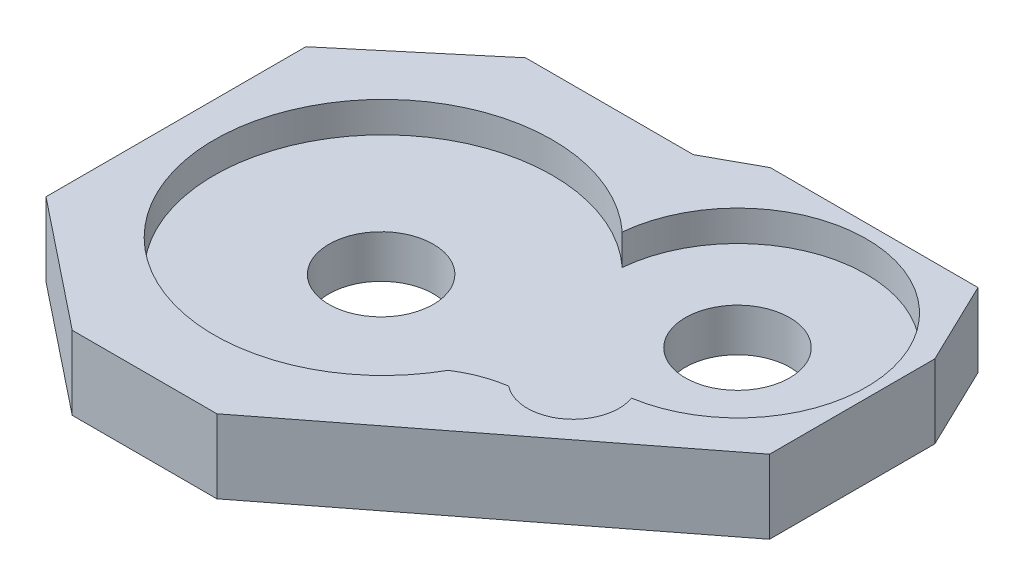
ISO-10303-21;
HEADER;
FILE_DESCRIPTION(('STEP AP214'),'2;1');
FILE_NAME('part.step','',(''),(''),'','','');
FILE_SCHEMA(('AUTOMOTIVE_DESIGN { 1 0 10303 214 1 1 1 1 }'));
ENDSEC;
DATA;
#1=APPLICATION_CONTEXT('core data for automotive mechanical design processes');
#2=APPLICATION_PROTOCOL_DEFINITION('international standard','automotive_design',2000,#1);
#3=PRODUCT_CONTEXT('',#1,'mechanical');
#4=PRODUCT('Part','Part','',(#3));
#5=PRODUCT_RELATED_PRODUCT_CATEGORY('part','',(#4));
#6=PRODUCT_DEFINITION_FORMATION('','',#4);
#7=PRODUCT_DEFINITION_CONTEXT('part definition',#1,'design');
#8=PRODUCT_DEFINITION('design','',#6,#7);
#9=PRODUCT_DEFINITION_SHAPE('','',#8);
#10=(LENGTH_UNIT() NAMED_UNIT(*) SI_UNIT(.MILLI.,.METRE.));
#11=(NAMED_UNIT(*) PLANE_ANGLE_UNIT() SI_UNIT($,.RADIAN.));
#12=(NAMED_UNIT(*) SI_UNIT($,.STERADIAN.) SOLID_ANGLE_UNIT());
#13=UNCERTAINTY_MEASURE_WITH_UNIT(LENGTH_MEASURE(1.E-05),#10,'distance_accuracy_value','');
#14=(GEOMETRIC_REPRESENTATION_CONTEXT(3) GLOBAL_UNCERTAINTY_ASSIGNED_CONTEXT((#13)) GLOBAL_UNIT_ASSIGNED_CONTEXT((#10,
#11,#12)) REPRESENTATION_CONTEXT('',''));
#15=CARTESIAN_POINT('',(0.,0.,0.));
#16=DIRECTION('',(0.,0.,1.));
#17=DIRECTION('',(1.,0.,0.));
#18=AXIS2_PLACEMENT_3D('',#15,#16,#17);
#19=CARTESIAN_POINT('',(13.9143508609378,10.,-16.1393030331925));
#20=DIRECTION('',(0.642916671040221,0.,0.765936129255279));
#21=DIRECTION('',(0.765936129255279,0.,-0.642916671040221));
#22=AXIS2_PLACEMENT_3D('',#19,#20,#21);
#23=PLANE('',#22);
#24=DIRECTION('',(-0.765936129255279,0.,0.642916671040221));
#25=VECTOR('',#24,1.);
#26=CARTESIAN_POINT('',(13.9143508609378,-2.,-16.1393030331925));
#27=LINE('',#26,#25);
#28=CARTESIAN_POINT('',(13.9143508609378,-2.,-16.1393030331925));
#29=VERTEX_POINT('',#28);
#30=CARTESIAN_POINT('',(-5.5384916629242,-2.,0.189156064136099));
#31=VERTEX_POINT('',#30);
#32=EDGE_CURVE('E153',#29,#31,#27,.T.);
#33=ORIENTED_EDGE('',*,*,#32,.T.);
#34=DIRECTION('',(0.,-1.,0.));
#35=VECTOR('',#34,1.);
#36=CARTESIAN_POINT('',(-5.5384916629242,10.,0.189156064136099));
#37=LINE('',#36,#35);
#38=CARTESIAN_POINT('',(-5.5384916629242,10.,0.189156064136099));
#39=VERTEX_POINT('',#38);
#40=EDGE_CURVE('E11',#39,#31,#37,.T.);
#41=ORIENTED_EDGE('',*,*,#40,.F.);
#42=DIRECTION('',(-0.765936129255279,0.,0.642916671040221));
#43=VECTOR('',#42,1.);
#44=CARTESIAN_POINT('',(13.9143508609378,10.,-16.1393030331925));
#45=LINE('',#44,#43);
#46=CARTESIAN_POINT('',(13.9143508609378,10.,-16.1393030331925));
#47=VERTEX_POINT('',#46);
#48=EDGE_CURVE('E173',#47,#39,#45,.T.);
#49=ORIENTED_EDGE('',*,*,#48,.F.);
#50=DIRECTION('',(0.,-1.,0.));
#51=VECTOR('',#50,1.);
#52=CARTESIAN_POINT('',(13.9143508609378,10.,-16.1393030331925));
#53=LINE('',#52,#51);
#54=EDGE_CURVE('E149',#47,#29,#53,.T.);
#55=ORIENTED_EDGE('',*,*,#54,.T.);
#56=EDGE_LOOP('',(#33,#41,#49,#55));
#57=FACE_BOUND('',#56,.T.);
#58=ADVANCED_FACE('F31',(#57),#23,.F.);
#59=CARTESIAN_POINT('',(-5.5384916629242,10.,0.189156064136099));
#60=DIRECTION('',(1.,0.,0.));
#61=DIRECTION('',(0.,0.,-1.));
#62=AXIS2_PLACEMENT_3D('',#59,#60,#61);
#63=PLANE('',#62);
#64=DIRECTION('',(0.,0.,1.));
#65=VECTOR('',#64,1.);
#66=CARTESIAN_POINT('',(-5.5384916629242,-2.,0.189156064136099));
#67=LINE('',#66,#65);
#68=CARTESIAN_POINT('',(-5.53849166292486,-2.,42.5147251773403));
#69=VERTEX_POINT('',#68);
#70=EDGE_CURVE('E156',#31,#69,#67,.T.);
#71=ORIENTED_EDGE('',*,*,#70,.T.);
#72=DIRECTION('',(0.,-1.,0.));
#73=VECTOR('',#72,1.);
#74=CARTESIAN_POINT('',(-5.53849166292486,10.,42.5147251773403));
#75=LINE('',#74,#73);
#76=CARTESIAN_POINT('',(-5.53849166292486,10.,42.5147251773403));
#77=VERTEX_POINT('',#76);
#78=EDGE_CURVE('E39',#77,#69,#75,.T.);
#79=ORIENTED_EDGE('',*,*,#78,.F.);
#80=DIRECTION('',(0.,0.,1.));
#81=VECTOR('',#80,1.);
#82=CARTESIAN_POINT('',(-5.5384916629242,10.,0.189156064136099));
#83=LINE('',#82,#81);
#84=EDGE_CURVE('E103',#39,#77,#83,.T.);
#85=ORIENTED_EDGE('',*,*,#84,.F.);
#86=ORIENTED_EDGE('',*,*,#40,.T.);
#87=EDGE_LOOP('',(#71,#79,#85,#86));
#88=FACE_BOUND('',#87,.T.);
#89=ADVANCED_FACE('F262',(#88),#63,.F.);
#90=CARTESIAN_POINT('',(15.4262000704736,10.,59.2085639757232));
#91=DIRECTION('',(0.622920671515874,0.,-0.7822850100815));
#92=DIRECTION('',(-0.7822850100815,0.,-0.622920671515874));
#93=AXIS2_PLACEMENT_3D('',#90,#91,#92);
#94=PLANE('',#93);
#95=DIRECTION('',(0.7822850100815,0.,0.622920671515874));
#96=VECTOR('',#95,1.);
#97=CARTESIAN_POINT('',(15.4262000704736,-2.,59.2085639757232));
#98=LINE('',#97,#96);
#99=CARTESIAN_POINT('',(15.4262000704736,-2.,59.2085639757232));
#100=VERTEX_POINT('',#99);
#101=EDGE_CURVE('E159',#69,#100,#98,.T.);
#102=ORIENTED_EDGE('',*,*,#101,.T.);
#103=DIRECTION('',(0.,-1.,0.));
#104=VECTOR('',#103,1.);
#105=CARTESIAN_POINT('',(15.4262000704736,10.,59.2085639757232));
#106=LINE('',#105,#104);
#107=CARTESIAN_POINT('',(15.4262000704736,10.,59.2085639757232));
#108=VERTEX_POINT('',#107);
#109=EDGE_CURVE('E186',#108,#100,#106,.T.);
#110=ORIENTED_EDGE('',*,*,#109,.F.);
#111=DIRECTION('',(0.7822850100815,0.,0.622920671515874));
#112=VECTOR('',#111,1.);
#113=CARTESIAN_POINT('',(15.4262000704736,10.,59.2085639757232));
#114=LINE('',#113,#112);
#115=EDGE_CURVE('E236',#77,#108,#114,.T.);
#116=ORIENTED_EDGE('',*,*,#115,.F.);
#117=ORIENTED_EDGE('',*,*,#78,.T.);
#118=EDGE_LOOP('',(#102,#110,#116,#117));
#119=FACE_BOUND('',#118,.T.);
#120=ADVANCED_FACE('F265',(#119),#94,.F.);
#121=CARTESIAN_POINT('',(38.9784117994287,10.,59.2085639757232));
#122=DIRECTION('',(0.,0.,-1.));
#123=DIRECTION('',(-1.,0.,0.));
#124=AXIS2_PLACEMENT_3D('',#121,#122,#123);
#125=PLANE('',#124);
#126=DIRECTION('',(1.,0.,0.));
#127=VECTOR('',#126,1.);
#128=CARTESIAN_POINT('',(38.9784117994287,-2.,59.2085639757232));
#129=LINE('',#128,#127);
#130=CARTESIAN_POINT('',(38.9784117994287,-2.,59.2085639757232));
#131=VERTEX_POINT('',#130);
#132=EDGE_CURVE('E161',#100,#131,#129,.T.);
#133=ORIENTED_EDGE('',*,*,#132,.T.);
#134=DIRECTION('',(0.,-1.,0.));
#135=VECTOR('',#134,1.);
#136=CARTESIAN_POINT('',(38.9784117994287,10.,59.2085639757232));
#137=LINE('',#136,#135);
#138=CARTESIAN_POINT('',(38.9784117994287,10.,59.2085639757232));
#139=VERTEX_POINT('',#138);
#140=EDGE_CURVE('E183',#139,#131,#137,.T.);
#141=ORIENTED_EDGE('',*,*,#140,.F.);
#142=DIRECTION('',(1.,0.,0.));
#143=VECTOR('',#142,1.);
#144=CARTESIAN_POINT('',(38.9784117994287,10.,59.2085639757232));
#145=LINE('',#144,#143);
#146=EDGE_CURVE('E238',#108,#139,#145,.T.);
#147=ORIENTED_EDGE('',*,*,#146,.F.);
#148=ORIENTED_EDGE('',*,*,#109,.T.);
#149=EDGE_LOOP('',(#133,#141,#147,#148));
#150=FACE_BOUND('',#149,.T.);
#151=ADVANCED_FACE('F270',(#150),#125,.F.);
#152=CARTESIAN_POINT('',(38.9784117994287,10.,59.2085639757232));
#153=DIRECTION('',(-0.612548801535923,0.,-0.790432771168368));
#154=DIRECTION('',(-0.790432771168368,0.,0.612548801535923));
#155=AXIS2_PLACEMENT_3D('',#152,#153,#154);
#156=PLANE('',#155);
#157=DIRECTION('',(0.790432771168368,0.,-0.612548801535923));
#158=VECTOR('',#157,1.);
#159=CARTESIAN_POINT('',(38.9784117994287,-2.,59.2085639757232));
#160=LINE('',#159,#158);
#161=CARTESIAN_POINT('',(89.6958984765078,-2.,19.9048599617339));
#162=VERTEX_POINT('',#161);
#163=EDGE_CURVE('E163',#131,#162,#160,.T.);
#164=ORIENTED_EDGE('',*,*,#163,.T.);
#165=DIRECTION('',(0.,-1.,0.));
#166=VECTOR('',#165,1.);
#167=CARTESIAN_POINT('',(89.6958984765078,10.,19.9048599617339));
#168=LINE('',#167,#166);
#169=CARTESIAN_POINT('',(89.6958984765078,10.,19.9048599617339));
#170=VERTEX_POINT('',#169);
#171=EDGE_CURVE('E180',#170,#162,#168,.T.);
#172=ORIENTED_EDGE('',*,*,#171,.F.);
#173=DIRECTION('',(0.790432771168368,0.,-0.612548801535923));
#174=VECTOR('',#173,1.);
#175=CARTESIAN_POINT('',(38.9784117994287,10.,59.2085639757232));
#176=LINE('',#175,#174);
#177=EDGE_CURVE('E240',#139,#170,#176,.T.);
#178=ORIENTED_EDGE('',*,*,#177,.F.);
#179=ORIENTED_EDGE('',*,*,#140,.T.);
#180=EDGE_LOOP('',(#164,#172,#178,#179));
#181=FACE_BOUND('',#180,.T.);
#182=ADVANCED_FACE('F273',(#181),#156,.F.);
#183=CARTESIAN_POINT('',(89.6958984765078,10.,19.9048599617339));
#184=DIRECTION('',(-1.,0.,0.));
#185=DIRECTION('',(0.,0.,1.));
#186=AXIS2_PLACEMENT_3D('',#183,#184,#185);
#187=PLANE('',#186);
#188=DIRECTION('',(0.,0.,-1.));
#189=VECTOR('',#188,1.);
#190=CARTESIAN_POINT('',(89.6958984765078,-2.,19.9048599617339));
#191=LINE('',#190,#189);
#192=CARTESIAN_POINT('',(89.6958984765078,-2.,-7.00483438225243));
#193=VERTEX_POINT('',#192);
#194=EDGE_CURVE('E165',#162,#193,#191,.T.);
#195=ORIENTED_EDGE('',*,*,#194,.T.);
#196=DIRECTION('',(0.,-1.,0.));
#197=VECTOR('',#196,1.);
#198=CARTESIAN_POINT('',(89.6958984765078,10.,-7.00483438225243));
#199=LINE('',#198,#197);
#200=CARTESIAN_POINT('',(89.6958984765078,10.,-7.00483438225243));
#201=VERTEX_POINT('',#200);
#202=EDGE_CURVE('E177',#201,#193,#199,.T.);
#203=ORIENTED_EDGE('',*,*,#202,.F.);
#204=DIRECTION('',(0.,0.,-1.));
#205=VECTOR('',#204,1.);
#206=CARTESIAN_POINT('',(89.6958984765078,10.,19.9048599617339));
#207=LINE('',#206,#205);
#208=EDGE_CURVE('E242',#170,#201,#207,.T.);
#209=ORIENTED_EDGE('',*,*,#208,.F.);
#210=ORIENTED_EDGE('',*,*,#171,.T.);
#211=EDGE_LOOP('',(#195,#203,#209,#210));
#212=FACE_BOUND('',#211,.T.);
#213=ADVANCED_FACE('F248',(#212),#187,.F.);
#214=CARTESIAN_POINT('',(83.1596520765568,10.,-20.5763674757882));
#215=DIRECTION('',(-0.900954840195988,0.,0.433912866745643));
#216=DIRECTION('',(0.433912866745643,0.,0.900954840195988));
#217=AXIS2_PLACEMENT_3D('',#214,#215,#216);
#218=PLANE('',#217);
#219=DIRECTION('',(-0.433912866745643,0.,-0.900954840195988));
#220=VECTOR('',#219,1.);
#221=CARTESIAN_POINT('',(83.1596520765568,-2.,-20.5763674757882));
#222=LINE('',#221,#220);
#223=CARTESIAN_POINT('',(83.1596520765568,-2.,-20.5763674757882));
#224=VERTEX_POINT('',#223);
#225=EDGE_CURVE('E167',#193,#224,#222,.T.);
#226=ORIENTED_EDGE('',*,*,#225,.T.);
#227=DIRECTION('',(0.,-1.,0.));
#228=VECTOR('',#227,1.);
#229=CARTESIAN_POINT('',(83.1596520765568,10.,-20.5763674757882));
#230=LINE('',#229,#228);
#231=CARTESIAN_POINT('',(83.1596520765568,10.,-20.5763674757882));
#232=VERTEX_POINT('',#231);
#233=EDGE_CURVE('E144',#232,#224,#230,.T.);
#234=ORIENTED_EDGE('',*,*,#233,.F.);
#235=DIRECTION('',(-0.433912866745643,0.,-0.900954840195988));
#236=VECTOR('',#235,1.);
#237=CARTESIAN_POINT('',(83.1596520765568,10.,-20.5763674757882));
#238=LINE('',#237,#236);
#239=EDGE_CURVE('E132',#201,#232,#238,.T.);
#240=ORIENTED_EDGE('',*,*,#239,.F.);
#241=ORIENTED_EDGE('',*,*,#202,.T.);
#242=EDGE_LOOP('',(#226,#234,#240,#241));
#243=FACE_BOUND('',#242,.T.);
#244=ADVANCED_FACE('F252',(#243),#218,.F.);
#245=CARTESIAN_POINT('',(83.1596520765568,10.,-20.5763674757882));
#246=DIRECTION('',(0.,0.,1.));
#247=DIRECTION('',(1.,0.,0.));
#248=AXIS2_PLACEMENT_3D('',#245,#246,#247);
#249=PLANE('',#248);
#250=DIRECTION('',(-1.,0.,0.));
#251=VECTOR('',#250,1.);
#252=CARTESIAN_POINT('',(83.1596520765568,-2.,-20.5763674757882));
#253=LINE('',#252,#251);
#254=CARTESIAN_POINT('',(49.3313262195362,-2.,-20.5763674757882));
#255=VERTEX_POINT('',#254);
#256=EDGE_CURVE('E141',#224,#255,#253,.T.);
#257=ORIENTED_EDGE('',*,*,#256,.T.);
#258=DIRECTION('',(0.,-1.,0.));
#259=VECTOR('',#258,1.);
#260=CARTESIAN_POINT('',(49.3313262195362,10.,-20.5763674757882));
#261=LINE('',#260,#259);
#262=CARTESIAN_POINT('',(49.3313262195362,10.,-20.5763674757882));
#263=VERTEX_POINT('',#262);
#264=EDGE_CURVE('E138',#263,#255,#261,.T.);
#265=ORIENTED_EDGE('',*,*,#264,.F.);
#266=DIRECTION('',(-1.,0.,0.));
#267=VECTOR('',#266,1.);
#268=CARTESIAN_POINT('',(83.1596520765568,10.,-20.5763674757882));
#269=LINE('',#268,#267);
#270=EDGE_CURVE('E125',#232,#263,#269,.T.);
#271=ORIENTED_EDGE('',*,*,#270,.F.);
#272=ORIENTED_EDGE('',*,*,#233,.T.);
#273=EDGE_LOOP('',(#257,#265,#271,#272));
#274=FACE_BOUND('',#273,.T.);
#275=ADVANCED_FACE('F139',(#274),#249,.F.);
#276=CARTESIAN_POINT('',(41.234335961373,10.,-16.1393030331921));
#277=DIRECTION('',(0.480564426467667,0.,0.876959424382794));
#278=DIRECTION('',(0.876959424382794,0.,-0.480564426467667));
#279=AXIS2_PLACEMENT_3D('',#276,#277,#278);
#280=PLANE('',#279);
#281=DIRECTION('',(-0.876959424382794,0.,0.480564426467667));
#282=VECTOR('',#281,1.);
#283=CARTESIAN_POINT('',(41.234335961373,-2.,-16.1393030331921));
#284=LINE('',#283,#282);
#285=CARTESIAN_POINT('',(41.234335961373,-2.,-16.1393030331921));
#286=VERTEX_POINT('',#285);
#287=EDGE_CURVE('E170',#255,#286,#284,.T.);
#288=ORIENTED_EDGE('',*,*,#287,.T.);
#289=DIRECTION('',(0.,-1.,0.));
#290=VECTOR('',#289,1.);
#291=CARTESIAN_POINT('',(41.234335961373,10.,-16.1393030331921));
#292=LINE('',#291,#290);
#293=CARTESIAN_POINT('',(41.234335961373,10.,-16.1393030331921));
#294=VERTEX_POINT('',#293);
#295=EDGE_CURVE('E145',#294,#286,#292,.T.);
#296=ORIENTED_EDGE('',*,*,#295,.F.);
#297=DIRECTION('',(-0.876959424382794,0.,0.480564426467667));
#298=VECTOR('',#297,1.);
#299=CARTESIAN_POINT('',(41.234335961373,10.,-16.1393030331921));
#300=LINE('',#299,#298);
#301=EDGE_CURVE('E129',#263,#294,#300,.T.);
#302=ORIENTED_EDGE('',*,*,#301,.F.);
#303=ORIENTED_EDGE('',*,*,#264,.T.);
#304=EDGE_LOOP('',(#288,#296,#302,#303));
#305=FACE_BOUND('',#304,.T.);
#306=ADVANCED_FACE('F147',(#305),#280,.F.);
#307=CARTESIAN_POINT('',(41.234335961373,10.,-16.1393030331921));
#308=DIRECTION('',(0.,0.,1.));
#309=DIRECTION('',(1.,0.,0.));
#310=AXIS2_PLACEMENT_3D('',#307,#308,#309);
#311=PLANE('',#310);
#312=DIRECTION('',(-1.,0.,0.));
#313=VECTOR('',#312,1.);
#314=CARTESIAN_POINT('',(41.234335961373,-2.,-16.1393030331921));
#315=LINE('',#314,#313);
#316=EDGE_CURVE('E95',#286,#29,#315,.T.);
#317=ORIENTED_EDGE('',*,*,#316,.T.);
#318=ORIENTED_EDGE('',*,*,#54,.F.);
#319=DIRECTION('',(-1.,0.,0.));
#320=VECTOR('',#319,1.);
#321=CARTESIAN_POINT('',(41.234335961373,10.,-16.1393030331921));
#322=LINE('',#321,#320);
#323=EDGE_CURVE('E56',#294,#47,#322,.T.);
#324=ORIENTED_EDGE('',*,*,#323,.F.);
#325=ORIENTED_EDGE('',*,*,#295,.T.);
#326=EDGE_LOOP('',(#317,#318,#324,#325));
#327=FACE_BOUND('',#326,.T.);
#328=ADVANCED_FACE('F256',(#327),#311,.F.);
#329=CARTESIAN_POINT('',(-31.4150808809404,10.,21.9096232969561));
#330=DIRECTION('',(0.,-1.,0.));
#331=DIRECTION('',(0.,0.,-1.));
#332=AXIS2_PLACEMENT_3D('',#329,#330,#331);
#333=PLANE('',#332);
#334=CARTESIAN_POINT('',(63.4944676594539,10.,25.6846911779234));
#335=DIRECTION('',(0.,1.,0.));
#336=DIRECTION('',(0.,0.,1.));
#337=AXIS2_PLACEMENT_3D('',#334,#335,#336);
#338=CIRCLE('',#337,7.47877992097396);
#339=CARTESIAN_POINT('',(58.8432924703218,10.,31.541201953664));
#340=VERTEX_POINT('',#339);
#341=CARTESIAN_POINT('',(70.5606789859329,10.,23.2350367949742));
#342=VERTEX_POINT('',#341);
#343=EDGE_CURVE('E195',#340,#342,#338,.T.);
#344=ORIENTED_EDGE('',*,*,#343,.F.);
#345=CARTESIAN_POINT('',(61.476480807474,10.,49.3074630657234));
#346=DIRECTION('',(0.,-1.,0.));
#347=DIRECTION('',(0.,0.,-1.));
#348=AXIS2_PLACEMENT_3D('',#345,#346,#347);
#349=CIRCLE('',#348,17.960337266343);
#350=CARTESIAN_POINT('',(51.6919142365099,10.,34.2463883451346));
#351=VERTEX_POINT('',#350);
#352=EDGE_CURVE('E47',#351,#340,#349,.T.);
#353=ORIENTED_EDGE('',*,*,#352,.F.);
#354=CARTESIAN_POINT('',(27.6642921265654,10.,20.7872258660176));
#355=DIRECTION('',(0.,1.,0.));
#356=DIRECTION('',(0.,0.,1.));
#357=AXIS2_PLACEMENT_3D('',#354,#355,#356);
#358=CIRCLE('',#357,27.5404371587955);
#359=CARTESIAN_POINT('',(46.3534344537463,10.,0.55874006079876));
#360=VERTEX_POINT('',#359);
#361=EDGE_CURVE('E209',#360,#351,#358,.T.);
#362=ORIENTED_EDGE('',*,*,#361,.F.);
#363=CARTESIAN_POINT('',(67.1896458009721,10.,2.57473491383906));
#364=DIRECTION('',(0.,1.,0.));
#365=DIRECTION('',(0.,0.,1.));
#366=AXIS2_PLACEMENT_3D('',#363,#364,#365);
#367=CIRCLE('',#366,20.933512331994);
#368=EDGE_CURVE('E221',#342,#360,#367,.T.);
#369=ORIENTED_EDGE('',*,*,#368,.F.);
#370=EDGE_LOOP('',(#344,#353,#362,#369));
#371=FACE_BOUND('',#370,.T.);
#372=ORIENTED_EDGE('',*,*,#48,.T.);
#373=ORIENTED_EDGE('',*,*,#84,.T.);
#374=ORIENTED_EDGE('',*,*,#115,.T.);
#375=ORIENTED_EDGE('',*,*,#146,.T.);
#376=ORIENTED_EDGE('',*,*,#177,.T.);
#377=ORIENTED_EDGE('',*,*,#208,.T.);
#378=ORIENTED_EDGE('',*,*,#239,.T.);
#379=ORIENTED_EDGE('',*,*,#270,.T.);
#380=ORIENTED_EDGE('',*,*,#301,.T.);
#381=ORIENTED_EDGE('',*,*,#323,.T.);
#382=EDGE_LOOP('',(#372,#373,#374,#375,#376,#377,#378,#379,#380,#381));
#383=FACE_BOUND('',#382,.T.);
#384=ADVANCED_FACE('F127',(#371,#383),#333,.F.);
#385=CARTESIAN_POINT('',(-31.4150808809404,-2.,21.9096232969561));
#386=DIRECTION('',(0.,-1.,0.));
#387=DIRECTION('',(0.,0.,-1.));
#388=AXIS2_PLACEMENT_3D('',#385,#386,#387);
#389=PLANE('',#388);
#390=CARTESIAN_POINT('',(67.0689477839397,-2.,2.49818414725791));
#391=DIRECTION('',(0.,-1.,0.));
#392=DIRECTION('',(0.,0.,-1.));
#393=AXIS2_PLACEMENT_3D('',#390,#391,#392);
#394=CIRCLE('',#393,8.49999999963974);
#395=CARTESIAN_POINT('',(67.0689477839397,-2.,-6.00181585238183));
#396=VERTEX_POINT('',#395);
#397=EDGE_CURVE('E202',#396,#396,#394,.T.);
#398=ORIENTED_EDGE('',*,*,#397,.F.);
#399=EDGE_LOOP('',(#398));
#400=FACE_BOUND('',#399,.T.);
#401=CARTESIAN_POINT('',(27.6885714632591,-2.,21.1627844356926));
#402=DIRECTION('',(0.,-1.,0.));
#403=DIRECTION('',(0.,0.,-1.));
#404=AXIS2_PLACEMENT_3D('',#401,#402,#403);
#405=CIRCLE('',#404,8.49999999999972);
#406=CARTESIAN_POINT('',(27.6885714632591,-2.,12.6627844356928));
#407=VERTEX_POINT('',#406);
#408=EDGE_CURVE('E192',#407,#407,#405,.T.);
#409=ORIENTED_EDGE('',*,*,#408,.F.);
#410=EDGE_LOOP('',(#409));
#411=FACE_BOUND('',#410,.T.);
#412=ORIENTED_EDGE('',*,*,#32,.F.);
#413=ORIENTED_EDGE('',*,*,#316,.F.);
#414=ORIENTED_EDGE('',*,*,#287,.F.);
#415=ORIENTED_EDGE('',*,*,#256,.F.);
#416=ORIENTED_EDGE('',*,*,#225,.F.);
#417=ORIENTED_EDGE('',*,*,#194,.F.);
#418=ORIENTED_EDGE('',*,*,#163,.F.);
#419=ORIENTED_EDGE('',*,*,#132,.F.);
#420=ORIENTED_EDGE('',*,*,#101,.F.);
#421=ORIENTED_EDGE('',*,*,#70,.F.);
#422=EDGE_LOOP('',(#412,#413,#414,#415,#416,#417,#418,#419,#420,#421));
#423=FACE_BOUND('',#422,.T.);
#424=ADVANCED_FACE('F255',(#400,#411,#423),#389,.T.);
#425=CARTESIAN_POINT('',(61.476480807474,5.,49.3074630657234));
#426=DIRECTION('',(0.,1.,0.));
#427=DIRECTION('',(0.,0.,1.));
#428=AXIS2_PLACEMENT_3D('',#425,#426,#427);
#429=CYLINDRICAL_SURFACE('',#428,17.960337266343);
#430=ORIENTED_EDGE('',*,*,#352,.T.);
#431=DIRECTION('',(0.,1.,0.));
#432=VECTOR('',#431,1.);
#433=CARTESIAN_POINT('',(58.8432924703218,5.,31.541201953664));
#434=LINE('',#433,#432);
#435=CARTESIAN_POINT('',(58.8432924703218,5.,31.541201953664));
#436=VERTEX_POINT('',#435);
#437=EDGE_CURVE('E217',#436,#340,#434,.T.);
#438=ORIENTED_EDGE('',*,*,#437,.F.);
#439=CARTESIAN_POINT('',(61.476480807474,5.,49.3074630657234));
#440=DIRECTION('',(0.,-1.,0.));
#441=DIRECTION('',(0.,0.,-1.));
#442=AXIS2_PLACEMENT_3D('',#439,#440,#441);
#443=CIRCLE('',#442,17.960337266343);
#444=CARTESIAN_POINT('',(51.6919142365099,5.,34.2463883451346));
#445=VERTEX_POINT('',#444);
#446=EDGE_CURVE('E205',#445,#436,#443,.T.);
#447=ORIENTED_EDGE('',*,*,#446,.F.);
#448=DIRECTION('',(0.,1.,0.));
#449=VECTOR('',#448,1.);
#450=CARTESIAN_POINT('',(51.6919142365099,5.,34.2463883451346));
#451=LINE('',#450,#449);
#452=EDGE_CURVE('E157',#445,#351,#451,.T.);
#453=ORIENTED_EDGE('',*,*,#452,.T.);
#454=EDGE_LOOP('',(#430,#438,#447,#453));
#455=FACE_BOUND('',#454,.T.);
#456=ADVANCED_FACE('F354',(#455),#429,.T.);
#457=CARTESIAN_POINT('',(27.6642921265654,5.,20.7872258660176));
#458=DIRECTION('',(0.,1.,0.));
#459=DIRECTION('',(0.,0.,1.));
#460=AXIS2_PLACEMENT_3D('',#457,#458,#459);
#461=CYLINDRICAL_SURFACE('',#460,27.5404371587955);
#462=ORIENTED_EDGE('',*,*,#361,.T.);
#463=ORIENTED_EDGE('',*,*,#452,.F.);
#464=CARTESIAN_POINT('',(27.6642921265654,5.,20.7872258660176));
#465=DIRECTION('',(0.,1.,0.));
#466=DIRECTION('',(0.,0.,1.));
#467=AXIS2_PLACEMENT_3D('',#464,#465,#466);
#468=CIRCLE('',#467,27.5404371587955);
#469=CARTESIAN_POINT('',(46.3534344537463,5.,0.55874006079876));
#470=VERTEX_POINT('',#469);
#471=EDGE_CURVE('E215',#470,#445,#468,.T.);
#472=ORIENTED_EDGE('',*,*,#471,.F.);
#473=DIRECTION('',(0.,1.,0.));
#474=VECTOR('',#473,1.);
#475=CARTESIAN_POINT('',(46.3534344537463,5.,0.55874006079876));
#476=LINE('',#475,#474);
#477=EDGE_CURVE('E227',#470,#360,#476,.T.);
#478=ORIENTED_EDGE('',*,*,#477,.T.);
#479=EDGE_LOOP('',(#462,#463,#472,#478));
#480=FACE_BOUND('',#479,.T.);
#481=ADVANCED_FACE('F359',(#480),#461,.F.);
#482=CARTESIAN_POINT('',(67.1896458009721,5.,2.57473491383906));
#483=DIRECTION('',(0.,1.,0.));
#484=DIRECTION('',(0.,0.,1.));
#485=AXIS2_PLACEMENT_3D('',#482,#483,#484);
#486=CYLINDRICAL_SURFACE('',#485,20.933512331994);
#487=ORIENTED_EDGE('',*,*,#368,.T.);
#488=ORIENTED_EDGE('',*,*,#477,.F.);
#489=CARTESIAN_POINT('',(67.1896458009721,5.,2.57473491383906));
#490=DIRECTION('',(0.,1.,0.));
#491=DIRECTION('',(0.,0.,1.));
#492=AXIS2_PLACEMENT_3D('',#489,#490,#491);
#493=CIRCLE('',#492,20.933512331994);
#494=CARTESIAN_POINT('',(70.5606789859329,5.,23.2350367949742));
#495=VERTEX_POINT('',#494);
#496=EDGE_CURVE('E212',#495,#470,#493,.T.);
#497=ORIENTED_EDGE('',*,*,#496,.F.);
#498=DIRECTION('',(0.,1.,0.));
#499=VECTOR('',#498,1.);
#500=CARTESIAN_POINT('',(70.5606789859329,5.,23.2350367949742));
#501=LINE('',#500,#499);
#502=EDGE_CURVE('E230',#495,#342,#501,.T.);
#503=ORIENTED_EDGE('',*,*,#502,.T.);
#504=EDGE_LOOP('',(#487,#488,#497,#503));
#505=FACE_BOUND('',#504,.T.);
#506=ADVANCED_FACE('F368',(#505),#486,.F.);
#507=CARTESIAN_POINT('',(63.4944676594539,5.,25.6846911779234));
#508=DIRECTION('',(0.,1.,0.));
#509=DIRECTION('',(0.,0.,1.));
#510=AXIS2_PLACEMENT_3D('',#507,#508,#509);
#511=CYLINDRICAL_SURFACE('',#510,7.47877992097396);
#512=ORIENTED_EDGE('',*,*,#343,.T.);
#513=ORIENTED_EDGE('',*,*,#502,.F.);
#514=CARTESIAN_POINT('',(63.4944676594539,5.,25.6846911779234));
#515=DIRECTION('',(0.,1.,0.));
#516=DIRECTION('',(0.,0.,1.));
#517=AXIS2_PLACEMENT_3D('',#514,#515,#516);
#518=CIRCLE('',#517,7.47877992097396);
#519=EDGE_CURVE('E208',#436,#495,#518,.T.);
#520=ORIENTED_EDGE('',*,*,#519,.F.);
#521=ORIENTED_EDGE('',*,*,#437,.T.);
#522=EDGE_LOOP('',(#512,#513,#520,#521));
#523=FACE_BOUND('',#522,.T.);
#524=ADVANCED_FACE('F378',(#523),#511,.F.);
#525=CARTESIAN_POINT('',(62.4854742334639,5.,37.4960771218234));
#526=DIRECTION('',(0.,-1.,0.));
#527=DIRECTION('',(0.,0.,-1.));
#528=AXIS2_PLACEMENT_3D('',#525,#526,#527);
#529=PLANE('',#528);
#530=CARTESIAN_POINT('',(67.0689477839397,5.,2.49818414725791));
#531=DIRECTION('',(0.,-1.,0.));
#532=DIRECTION('',(0.,0.,-1.));
#533=AXIS2_PLACEMENT_3D('',#530,#531,#532);
#534=CIRCLE('',#533,8.49999999963974);
#535=CARTESIAN_POINT('',(67.0689477839397,5.,-6.00181585238183));
#536=VERTEX_POINT('',#535);
#537=EDGE_CURVE('E34',#536,#536,#534,.T.);
#538=ORIENTED_EDGE('',*,*,#537,.T.);
#539=EDGE_LOOP('',(#538));
#540=FACE_BOUND('',#539,.T.);
#541=CARTESIAN_POINT('',(27.6885714632591,5.,21.1627844356926));
#542=DIRECTION('',(0.,-1.,0.));
#543=DIRECTION('',(0.,0.,-1.));
#544=AXIS2_PLACEMENT_3D('',#541,#542,#543);
#545=CIRCLE('',#544,8.49999999999972);
#546=CARTESIAN_POINT('',(27.6885714632591,5.,12.6627844356928));
#547=VERTEX_POINT('',#546);
#548=EDGE_CURVE('E190',#547,#547,#545,.T.);
#549=ORIENTED_EDGE('',*,*,#548,.T.);
#550=EDGE_LOOP('',(#549));
#551=FACE_BOUND('',#550,.T.);
#552=ORIENTED_EDGE('',*,*,#446,.T.);
#553=ORIENTED_EDGE('',*,*,#519,.T.);
#554=ORIENTED_EDGE('',*,*,#496,.T.);
#555=ORIENTED_EDGE('',*,*,#471,.T.);
#556=EDGE_LOOP('',(#552,#553,#554,#555));
#557=FACE_BOUND('',#556,.T.);
#558=ADVANCED_FACE('F388',(#540,#551,#557),#529,.F.);
#559=CARTESIAN_POINT('',(27.6885714632591,10.,21.1627844356926));
#560=DIRECTION('',(0.,-1.,0.));
#561=DIRECTION('',(0.,0.,-1.));
#562=AXIS2_PLACEMENT_3D('',#559,#560,#561);
#563=CYLINDRICAL_SURFACE('',#562,8.49999999999972);
#564=ORIENTED_EDGE('',*,*,#408,.T.);
#565=EDGE_LOOP('',(#564));
#566=FACE_BOUND('',#565,.T.);
#567=ORIENTED_EDGE('',*,*,#548,.F.);
#568=EDGE_LOOP('',(#567));
#569=FACE_BOUND('',#568,.T.);
#570=ADVANCED_FACE('F405',(#566,#569),#563,.F.);
#571=CARTESIAN_POINT('',(67.0689477839397,10.,2.49818414725791));
#572=DIRECTION('',(0.,-1.,0.));
#573=DIRECTION('',(0.,0.,-1.));
#574=AXIS2_PLACEMENT_3D('',#571,#572,#573);
#575=CYLINDRICAL_SURFACE('',#574,8.49999999963974);
#576=ORIENTED_EDGE('',*,*,#397,.T.);
#577=EDGE_LOOP('',(#576));
#578=FACE_BOUND('',#577,.T.);
#579=ORIENTED_EDGE('',*,*,#537,.F.);
#580=EDGE_LOOP('',(#579));
#581=FACE_BOUND('',#580,.T.);
#582=ADVANCED_FACE('F415',(#578,#581),#575,.F.);
#583=CLOSED_SHELL('',(#58,#89,#120,#151,#182,#213,#244,#275,#306,#328,#384,#424,#456,#481,#506,
#524,#558,#570,#582));
#584=MANIFOLD_SOLID_BREP('B2',#583);
#585=ADVANCED_BREP_SHAPE_REPRESENTATION('',(#18,#584),#14);
#586=SHAPE_DEFINITION_REPRESENTATION(#9,#585);
ENDSEC;
END-ISO-10303-21;
